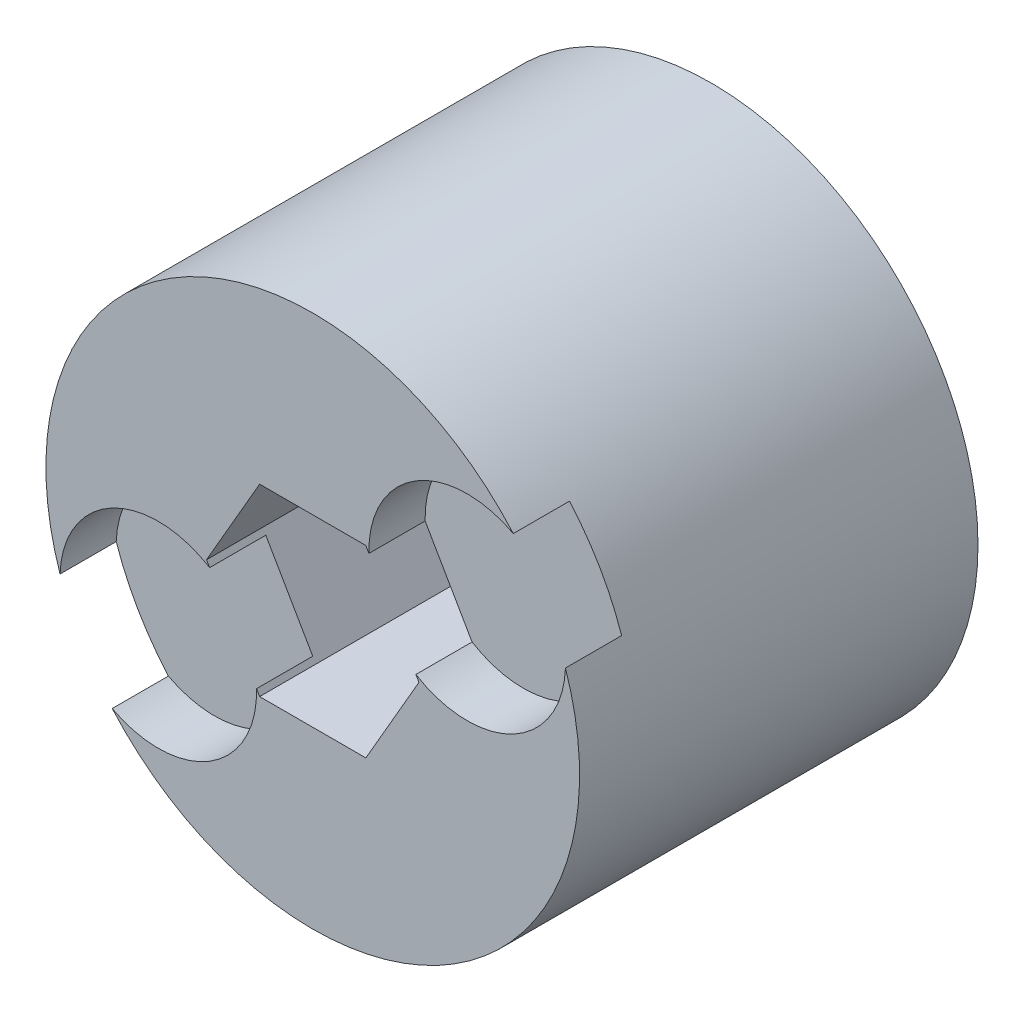
ISO-10303-21;
HEADER;
FILE_DESCRIPTION(('STEP AP214'),'2;1');
FILE_NAME('part.step','',(''),(''),'','','');
FILE_SCHEMA(('AUTOMOTIVE_DESIGN { 1 0 10303 214 1 1 1 1 }'));
ENDSEC;
DATA;
#1=APPLICATION_CONTEXT('core data for automotive mechanical design processes');
#2=APPLICATION_PROTOCOL_DEFINITION('international standard','automotive_design',2000,#1);
#3=PRODUCT_CONTEXT('',#1,'mechanical');
#4=PRODUCT('Part','Part','',(#3));
#5=PRODUCT_RELATED_PRODUCT_CATEGORY('part','',(#4));
#6=PRODUCT_DEFINITION_FORMATION('','',#4);
#7=PRODUCT_DEFINITION_CONTEXT('part definition',#1,'design');
#8=PRODUCT_DEFINITION('design','',#6,#7);
#9=PRODUCT_DEFINITION_SHAPE('','',#8);
#10=(LENGTH_UNIT() NAMED_UNIT(*) SI_UNIT(.MILLI.,.METRE.));
#11=(NAMED_UNIT(*) PLANE_ANGLE_UNIT() SI_UNIT($,.RADIAN.));
#12=(NAMED_UNIT(*) SI_UNIT($,.STERADIAN.) SOLID_ANGLE_UNIT());
#13=UNCERTAINTY_MEASURE_WITH_UNIT(LENGTH_MEASURE(1.E-05),#10,'distance_accuracy_value','');
#14=(GEOMETRIC_REPRESENTATION_CONTEXT(3) GLOBAL_UNCERTAINTY_ASSIGNED_CONTEXT((#13)) GLOBAL_UNIT_ASSIGNED_CONTEXT((#10,
#11,#12)) REPRESENTATION_CONTEXT('',''));
#15=CARTESIAN_POINT('',(0.,0.,0.));
#16=DIRECTION('',(0.,0.,1.));
#17=DIRECTION('',(1.,0.,0.));
#18=AXIS2_PLACEMENT_3D('',#15,#16,#17);
#19=CARTESIAN_POINT('',(0.,3.43496841987304E-13,14.185));
#20=DIRECTION('',(0.,0.,-1.));
#21=DIRECTION('',(0.500000000000004,-0.866025403784436,0.));
#22=AXIS2_PLACEMENT_3D('',#19,#20,#21);
#23=PLANE('',#22);
#24=CARTESIAN_POINT('',(0.,3.41369630215652E-13,14.185));
#25=DIRECTION('',(0.,0.,-1.));
#26=DIRECTION('',(0.,1.,0.));
#27=AXIS2_PLACEMENT_3D('',#24,#25,#26);
#28=CIRCLE('',#27,9.5);
#29=CARTESIAN_POINT('',(8.99703364415569,3.05014517784527,14.185));
#30=VERTEX_POINT('',#29);
#31=CARTESIAN_POINT('',(-7.14002003132211,-6.26658710561935,14.185));
#32=VERTEX_POINT('',#31);
#33=EDGE_CURVE('E196',#30,#32,#28,.T.);
#34=ORIENTED_EDGE('',*,*,#33,.F.);
#35=CARTESIAN_POINT('',(5.49926131403118,3.17500000000037,14.185));
#36=DIRECTION('',(0.,0.,-1.));
#37=DIRECTION('',(0.,1.,0.));
#38=AXIS2_PLACEMENT_3D('',#35,#36,#37);
#39=CIRCLE('',#38,3.50000000000001);
#40=CARTESIAN_POINT('',(3.67205240631425,0.189818664208528,14.185));
#41=VERTEX_POINT('',#40);
#42=EDGE_CURVE('E159',#30,#41,#39,.T.);
#43=ORIENTED_EDGE('',*,*,#42,.T.);
#44=DIRECTION('',(0.5,-0.866025403784439,0.));
#45=VECTOR('',#44,1.);
#46=CARTESIAN_POINT('',(1.89082213159591,3.27500000000057,14.185));
#47=LINE('',#46,#45);
#48=CARTESIAN_POINT('',(3.78164426319206,3.40873163029443E-13,14.185));
#49=VERTEX_POINT('',#48);
#50=EDGE_CURVE('E173',#41,#49,#47,.T.);
#51=ORIENTED_EDGE('',*,*,#50,.T.);
#52=DIRECTION('',(-0.5,-0.866025403784439,0.));
#53=VECTOR('',#52,1.);
#54=CARTESIAN_POINT('',(3.78164426319219,5.49315979621161E-13,14.185));
#55=LINE('',#54,#53);
#56=CARTESIAN_POINT('',(1.89082213159604,-3.27499999999966,14.1849999999999));
#57=VERTEX_POINT('',#56);
#58=EDGE_CURVE('E176',#49,#57,#55,.T.);
#59=ORIENTED_EDGE('',*,*,#58,.T.);
#60=DIRECTION('',(-1.,0.,0.));
#61=VECTOR('',#60,1.);
#62=CARTESIAN_POINT('',(1.89082213159602,-3.27499999999966,14.1849999999999));
#63=LINE('',#62,#61);
#64=CARTESIAN_POINT('',(-1.89082213159602,-3.27499999999966,14.1849999999999));
#65=VERTEX_POINT('',#64);
#66=EDGE_CURVE('E178',#57,#65,#63,.T.);
#67=ORIENTED_EDGE('',*,*,#66,.T.);
#68=DIRECTION('',(-0.500000000000001,0.866025403784438,0.));
#69=VECTOR('',#68,1.);
#70=CARTESIAN_POINT('',(-1.89082213159614,-3.27499999999944,14.1849999999999));
#71=LINE('',#70,#69);
#72=CARTESIAN_POINT('',(-2.00041398847381,-3.08518133579152,14.185));
#73=VERTEX_POINT('',#72);
#74=EDGE_CURVE('E166',#65,#73,#71,.T.);
#75=ORIENTED_EDGE('',*,*,#74,.T.);
#76=CARTESIAN_POINT('',(-5.49926131403116,-3.17499999999968,14.1849999999999));
#77=DIRECTION('',(0.,0.,-1.));
#78=DIRECTION('',(0.,1.,0.));
#79=AXIS2_PLACEMENT_3D('',#76,#77,#78);
#80=CIRCLE('',#79,3.5);
#81=EDGE_CURVE('E143',#73,#32,#80,.T.);
#82=ORIENTED_EDGE('',*,*,#81,.T.);
#83=EDGE_LOOP('',(#34,#43,#51,#59,#67,#75,#82));
#84=FACE_BOUND('',#83,.T.);
#85=ADVANCED_FACE('F34',(#84),#23,.F.);
#86=CARTESIAN_POINT('',(0.,3.41369630215652E-13,0.));
#87=DIRECTION('',(0.,0.,1.));
#88=DIRECTION('',(1.,0.,0.));
#89=AXIS2_PLACEMENT_3D('',#86,#87,#88);
#90=PLANE('',#89);
#91=CARTESIAN_POINT('',(0.,3.41369630215652E-13,0.));
#92=DIRECTION('',(0.,0.,1.));
#93=DIRECTION('',(1.,0.,0.));
#94=AXIS2_PLACEMENT_3D('',#91,#92,#93);
#95=CIRCLE('',#94,9.5);
#96=CARTESIAN_POINT('',(9.50000000000001,3.41369630215652E-13,0.));
#97=VERTEX_POINT('',#96);
#98=EDGE_CURVE('E191',#97,#97,#95,.T.);
#99=ORIENTED_EDGE('',*,*,#98,.F.);
#100=EDGE_LOOP('',(#99));
#101=FACE_BOUND('',#100,.T.);
#102=DIRECTION('',(0.5,0.866025403784439,0.));
#103=VECTOR('',#102,1.);
#104=CARTESIAN_POINT('',(3.78164426319206,3.40719108912161E-13,0.));
#105=LINE('',#104,#103);
#106=CARTESIAN_POINT('',(1.89082213159604,-3.27499999999966,0.));
#107=VERTEX_POINT('',#106);
#108=CARTESIAN_POINT('',(3.78164426319206,3.40719108912161E-13,0.));
#109=VERTEX_POINT('',#108);
#110=EDGE_CURVE('E198',#107,#109,#105,.T.);
#111=ORIENTED_EDGE('',*,*,#110,.T.);
#112=DIRECTION('',(-0.5,0.866025403784438,0.));
#113=VECTOR('',#112,1.);
#114=CARTESIAN_POINT('',(1.89082213159603,3.27500000000035,0.));
#115=LINE('',#114,#113);
#116=CARTESIAN_POINT('',(1.89082213159603,3.27500000000035,0.));
#117=VERTEX_POINT('',#116);
#118=EDGE_CURVE('E201',#109,#117,#115,.T.);
#119=ORIENTED_EDGE('',*,*,#118,.T.);
#120=DIRECTION('',(-1.,0.,0.));
#121=VECTOR('',#120,1.);
#122=CARTESIAN_POINT('',(-1.89082213159602,3.27500000000034,0.));
#123=LINE('',#122,#121);
#124=CARTESIAN_POINT('',(-1.89082213159602,3.27500000000034,0.));
#125=VERTEX_POINT('',#124);
#126=EDGE_CURVE('E205',#117,#125,#123,.T.);
#127=ORIENTED_EDGE('',*,*,#126,.T.);
#128=DIRECTION('',(-0.499999999999999,-0.866025403784439,0.));
#129=VECTOR('',#128,1.);
#130=CARTESIAN_POINT('',(-3.78164426319204,3.39634906739675E-13,0.));
#131=LINE('',#130,#129);
#132=CARTESIAN_POINT('',(-3.78164426319204,3.39634906739675E-13,0.));
#133=VERTEX_POINT('',#132);
#134=EDGE_CURVE('E208',#125,#133,#131,.T.);
#135=ORIENTED_EDGE('',*,*,#134,.T.);
#136=DIRECTION('',(0.500000000000001,-0.866025403784438,0.));
#137=VECTOR('',#136,1.);
#138=CARTESIAN_POINT('',(-1.89082213159602,-3.27499999999966,0.));
#139=LINE('',#138,#137);
#140=CARTESIAN_POINT('',(-1.89082213159602,-3.27499999999966,0.));
#141=VERTEX_POINT('',#140);
#142=EDGE_CURVE('E211',#133,#141,#139,.T.);
#143=ORIENTED_EDGE('',*,*,#142,.T.);
#144=DIRECTION('',(1.,0.,0.));
#145=VECTOR('',#144,1.);
#146=CARTESIAN_POINT('',(1.89082213159604,-3.27499999999966,0.));
#147=LINE('',#146,#145);
#148=EDGE_CURVE('E197',#141,#107,#147,.T.);
#149=ORIENTED_EDGE('',*,*,#148,.T.);
#150=EDGE_LOOP('',(#111,#119,#127,#135,#143,#149));
#151=FACE_BOUND('',#150,.T.);
#152=ADVANCED_FACE('F272',(#101,#151),#90,.F.);
#153=CARTESIAN_POINT('',(0.,3.41369630215652E-13,41.2550576850888));
#154=DIRECTION('',(0.,0.,-1.));
#155=DIRECTION('',(-1.,0.,0.));
#156=AXIS2_PLACEMENT_3D('',#153,#154,#155);
#157=CYLINDRICAL_SURFACE('',#156,9.5);
#158=CARTESIAN_POINT('',(0.,3.41369630215652E-13,12.185));
#159=DIRECTION('',(0.,0.,1.));
#160=DIRECTION('',(1.,0.,0.));
#161=AXIS2_PLACEMENT_3D('',#158,#159,#160);
#162=CIRCLE('',#161,9.5);
#163=CARTESIAN_POINT('',(8.99703364415569,3.05014517784527,12.185));
#164=VERTEX_POINT('',#163);
#165=CARTESIAN_POINT('',(7.1400200313221,6.26658710562005,12.185));
#166=VERTEX_POINT('',#165);
#167=EDGE_CURVE('E202',#164,#166,#162,.T.);
#168=ORIENTED_EDGE('',*,*,#167,.F.);
#169=DIRECTION('',(0.,0.,1.));
#170=VECTOR('',#169,1.);
#171=CARTESIAN_POINT('',(8.99703364415569,3.05014517784527,13.185));
#172=LINE('',#171,#170);
#173=EDGE_CURVE('E220',#164,#30,#172,.T.);
#174=ORIENTED_EDGE('',*,*,#173,.T.);
#175=ORIENTED_EDGE('',*,*,#33,.T.);
#176=DIRECTION('',(0.,0.,1.));
#177=VECTOR('',#176,1.);
#178=CARTESIAN_POINT('',(-7.14002003132211,-6.26658710561935,13.185));
#179=LINE('',#178,#177);
#180=CARTESIAN_POINT('',(-7.1400200313221,-6.26658710561935,12.185));
#181=VERTEX_POINT('',#180);
#182=EDGE_CURVE('E231',#32,#181,#179,.F.);
#183=ORIENTED_EDGE('',*,*,#182,.T.);
#184=CARTESIAN_POINT('',(0.,3.41369630215652E-13,12.185));
#185=DIRECTION('',(0.,0.,1.));
#186=DIRECTION('',(1.,0.,0.));
#187=AXIS2_PLACEMENT_3D('',#184,#185,#186);
#188=CIRCLE('',#187,9.5);
#189=CARTESIAN_POINT('',(-8.99703364415567,-3.0501451778446,12.185));
#190=VERTEX_POINT('',#189);
#191=EDGE_CURVE('E154',#190,#181,#188,.T.);
#192=ORIENTED_EDGE('',*,*,#191,.F.);
#193=DIRECTION('',(0.,0.,1.));
#194=VECTOR('',#193,1.);
#195=CARTESIAN_POINT('',(-8.99703364415567,-3.05014517784461,13.185));
#196=LINE('',#195,#194);
#197=CARTESIAN_POINT('',(-8.99703364415567,-3.05014517784461,14.185));
#198=VERTEX_POINT('',#197);
#199=EDGE_CURVE('E228',#190,#198,#196,.T.);
#200=ORIENTED_EDGE('',*,*,#199,.T.);
#201=CARTESIAN_POINT('',(7.1400200313221,6.26658710562005,14.185));
#202=VERTEX_POINT('',#201);
#203=EDGE_CURVE('E193',#198,#202,#28,.T.);
#204=ORIENTED_EDGE('',*,*,#203,.T.);
#205=DIRECTION('',(0.,0.,1.));
#206=VECTOR('',#205,1.);
#207=CARTESIAN_POINT('',(7.1400200313221,6.26658710562005,13.185));
#208=LINE('',#207,#206);
#209=EDGE_CURVE('E49',#202,#166,#208,.F.);
#210=ORIENTED_EDGE('',*,*,#209,.T.);
#211=EDGE_LOOP('',(#168,#174,#175,#183,#192,#200,#204,#210));
#212=FACE_BOUND('',#211,.T.);
#213=ORIENTED_EDGE('',*,*,#98,.T.);
#214=EDGE_LOOP('',(#213));
#215=FACE_BOUND('',#214,.T.);
#216=ADVANCED_FACE('F246',(#212,#215),#157,.T.);
#217=CARTESIAN_POINT('',(3.78164426319206,3.40719108912161E-13,41.2550576850888));
#218=DIRECTION('',(-0.866025403784439,0.5,0.));
#219=DIRECTION('',(-0.5,-0.866025403784439,0.));
#220=AXIS2_PLACEMENT_3D('',#217,#218,#219);
#221=PLANE('',#220);
#222=ORIENTED_EDGE('',*,*,#58,.F.);
#223=DIRECTION('',(0.,0.,-1.));
#224=VECTOR('',#223,1.);
#225=CARTESIAN_POINT('',(3.78164426319206,3.40719108912161E-13,41.2550576850888));
#226=LINE('',#225,#224);
#227=EDGE_CURVE('E189',#49,#109,#226,.T.);
#228=ORIENTED_EDGE('',*,*,#227,.T.);
#229=ORIENTED_EDGE('',*,*,#110,.F.);
#230=DIRECTION('',(0.,0.,-1.));
#231=VECTOR('',#230,1.);
#232=CARTESIAN_POINT('',(1.89082213159604,-3.27499999999966,41.2550576850888));
#233=LINE('',#232,#231);
#234=EDGE_CURVE('E179',#57,#107,#233,.T.);
#235=ORIENTED_EDGE('',*,*,#234,.F.);
#236=EDGE_LOOP('',(#222,#228,#229,#235));
#237=FACE_BOUND('',#236,.T.);
#238=ADVANCED_FACE('F285',(#237),#221,.T.);
#239=CARTESIAN_POINT('',(1.89082213159603,3.27500000000035,41.2550576850888));
#240=DIRECTION('',(-0.866025403784438,-0.5,0.));
#241=DIRECTION('',(0.5,-0.866025403784439,0.));
#242=AXIS2_PLACEMENT_3D('',#239,#240,#241);
#243=PLANE('',#242);
#244=DIRECTION('',(0.,0.,1.));
#245=VECTOR('',#244,1.);
#246=CARTESIAN_POINT('',(3.67205240631425,0.189818664208528,12.185));
#247=LINE('',#246,#245);
#248=CARTESIAN_POINT('',(3.67205240631425,0.189818664208528,12.185));
#249=VERTEX_POINT('',#248);
#250=EDGE_CURVE('E224',#249,#41,#247,.T.);
#251=ORIENTED_EDGE('',*,*,#250,.F.);
#252=DIRECTION('',(-0.5,0.866025403784439,0.));
#253=VECTOR('',#252,1.);
#254=CARTESIAN_POINT('',(1.89082213159603,3.27500000000035,12.185));
#255=LINE('',#254,#253);
#256=CARTESIAN_POINT('',(2.00041398847382,3.08518133579221,12.185));
#257=VERTEX_POINT('',#256);
#258=EDGE_CURVE('E12',#249,#257,#255,.T.);
#259=ORIENTED_EDGE('',*,*,#258,.T.);
#260=DIRECTION('',(0.,0.,1.));
#261=VECTOR('',#260,1.);
#262=CARTESIAN_POINT('',(2.00041398847382,3.08518133579221,12.185));
#263=LINE('',#262,#261);
#264=CARTESIAN_POINT('',(2.00041398847382,3.08518133579221,14.185));
#265=VERTEX_POINT('',#264);
#266=EDGE_CURVE('E226',#265,#257,#263,.F.);
#267=ORIENTED_EDGE('',*,*,#266,.F.);
#268=CARTESIAN_POINT('',(1.89082213159603,3.27500000000035,14.185));
#269=VERTEX_POINT('',#268);
#270=EDGE_CURVE('E165',#269,#265,#47,.T.);
#271=ORIENTED_EDGE('',*,*,#270,.F.);
#272=DIRECTION('',(0.,0.,-1.));
#273=VECTOR('',#272,1.);
#274=CARTESIAN_POINT('',(1.89082213159603,3.27500000000035,41.2550576850888));
#275=LINE('',#274,#273);
#276=EDGE_CURVE('E187',#269,#117,#275,.T.);
#277=ORIENTED_EDGE('',*,*,#276,.T.);
#278=ORIENTED_EDGE('',*,*,#118,.F.);
#279=ORIENTED_EDGE('',*,*,#227,.F.);
#280=ORIENTED_EDGE('',*,*,#50,.F.);
#281=EDGE_LOOP('',(#251,#259,#267,#271,#277,#278,#279,#280));
#282=FACE_BOUND('',#281,.T.);
#283=ADVANCED_FACE('F256',(#282),#243,.T.);
#284=CARTESIAN_POINT('',(-1.89082213159602,3.27500000000034,41.2550576850888));
#285=DIRECTION('',(0.,-1.,0.));
#286=DIRECTION('',(1.,0.,0.));
#287=AXIS2_PLACEMENT_3D('',#284,#285,#286);
#288=PLANE('',#287);
#289=DIRECTION('',(1.,0.,0.));
#290=VECTOR('',#289,1.);
#291=CARTESIAN_POINT('',(-1.89082213159604,3.27500000000034,14.185));
#292=LINE('',#291,#290);
#293=CARTESIAN_POINT('',(-1.89082213159602,3.27500000000034,14.185));
#294=VERTEX_POINT('',#293);
#295=EDGE_CURVE('E171',#294,#269,#292,.T.);
#296=ORIENTED_EDGE('',*,*,#295,.F.);
#297=DIRECTION('',(0.,0.,-1.));
#298=VECTOR('',#297,1.);
#299=CARTESIAN_POINT('',(-1.89082213159602,3.27500000000034,41.2550576850888));
#300=LINE('',#299,#298);
#301=EDGE_CURVE('E185',#294,#125,#300,.T.);
#302=ORIENTED_EDGE('',*,*,#301,.T.);
#303=ORIENTED_EDGE('',*,*,#126,.F.);
#304=ORIENTED_EDGE('',*,*,#276,.F.);
#305=EDGE_LOOP('',(#296,#302,#303,#304));
#306=FACE_BOUND('',#305,.T.);
#307=ADVANCED_FACE('F281',(#306),#288,.T.);
#308=CARTESIAN_POINT('',(-3.78164426319204,3.39634906739675E-13,41.2550576850888));
#309=DIRECTION('',(0.866025403784439,-0.499999999999999,0.));
#310=DIRECTION('',(0.5,0.866025403784439,0.));
#311=AXIS2_PLACEMENT_3D('',#308,#309,#310);
#312=PLANE('',#311);
#313=DIRECTION('',(0.5,0.866025403784439,0.));
#314=VECTOR('',#313,1.);
#315=CARTESIAN_POINT('',(-3.78164426319192,5.48231777448676E-13,14.185));
#316=LINE('',#315,#314);
#317=CARTESIAN_POINT('',(-3.78164426319204,3.3957212042246E-13,14.185));
#318=VERTEX_POINT('',#317);
#319=EDGE_CURVE('E168',#318,#294,#316,.T.);
#320=ORIENTED_EDGE('',*,*,#319,.F.);
#321=DIRECTION('',(0.,0.,-1.));
#322=VECTOR('',#321,1.);
#323=CARTESIAN_POINT('',(-3.78164426319204,3.39634906739675E-13,41.2550576850888));
#324=LINE('',#323,#322);
#325=EDGE_CURVE('E183',#318,#133,#324,.T.);
#326=ORIENTED_EDGE('',*,*,#325,.T.);
#327=ORIENTED_EDGE('',*,*,#134,.F.);
#328=ORIENTED_EDGE('',*,*,#301,.F.);
#329=EDGE_LOOP('',(#320,#326,#327,#328));
#330=FACE_BOUND('',#329,.T.);
#331=ADVANCED_FACE('F277',(#330),#312,.T.);
#332=CARTESIAN_POINT('',(-1.89082213159602,-3.27499999999966,41.2550576850888));
#333=DIRECTION('',(0.866025403784438,0.5,0.));
#334=DIRECTION('',(-0.500000000000001,0.866025403784438,0.));
#335=AXIS2_PLACEMENT_3D('',#332,#333,#334);
#336=PLANE('',#335);
#337=DIRECTION('',(0.,0.,1.));
#338=VECTOR('',#337,1.);
#339=CARTESIAN_POINT('',(-3.67205240631423,-0.189818664207852,12.185));
#340=LINE('',#339,#338);
#341=CARTESIAN_POINT('',(-3.67205240631423,-0.189818664207853,12.185));
#342=VERTEX_POINT('',#341);
#343=CARTESIAN_POINT('',(-3.67205240631423,-0.189818664207854,14.185));
#344=VERTEX_POINT('',#343);
#345=EDGE_CURVE('E57',#342,#344,#340,.T.);
#346=ORIENTED_EDGE('',*,*,#345,.F.);
#347=DIRECTION('',(0.500000000000001,-0.866025403784438,0.));
#348=VECTOR('',#347,1.);
#349=CARTESIAN_POINT('',(-1.89082213159602,-3.27499999999966,12.185));
#350=LINE('',#349,#348);
#351=CARTESIAN_POINT('',(-2.0004139884738,-3.08518133579152,12.185));
#352=VERTEX_POINT('',#351);
#353=EDGE_CURVE('E42',#342,#352,#350,.T.);
#354=ORIENTED_EDGE('',*,*,#353,.T.);
#355=DIRECTION('',(0.,0.,1.));
#356=VECTOR('',#355,1.);
#357=CARTESIAN_POINT('',(-2.00041398847381,-3.08518133579152,12.185));
#358=LINE('',#357,#356);
#359=EDGE_CURVE('E137',#73,#352,#358,.F.);
#360=ORIENTED_EDGE('',*,*,#359,.F.);
#361=ORIENTED_EDGE('',*,*,#74,.F.);
#362=DIRECTION('',(0.,0.,-1.));
#363=VECTOR('',#362,1.);
#364=CARTESIAN_POINT('',(-1.89082213159602,-3.27499999999966,41.2550576850888));
#365=LINE('',#364,#363);
#366=EDGE_CURVE('E181',#65,#141,#365,.T.);
#367=ORIENTED_EDGE('',*,*,#366,.T.);
#368=ORIENTED_EDGE('',*,*,#142,.F.);
#369=ORIENTED_EDGE('',*,*,#325,.F.);
#370=EDGE_CURVE('E169',#344,#318,#71,.T.);
#371=ORIENTED_EDGE('',*,*,#370,.F.);
#372=EDGE_LOOP('',(#346,#354,#360,#361,#367,#368,#369,#371));
#373=FACE_BOUND('',#372,.T.);
#374=ADVANCED_FACE('F157',(#373),#336,.T.);
#375=CARTESIAN_POINT('',(1.89082213159604,-3.27499999999966,41.2550576850888));
#376=DIRECTION('',(0.,1.,0.));
#377=DIRECTION('',(-1.,0.,0.));
#378=AXIS2_PLACEMENT_3D('',#375,#376,#377);
#379=PLANE('',#378);
#380=ORIENTED_EDGE('',*,*,#66,.F.);
#381=ORIENTED_EDGE('',*,*,#234,.T.);
#382=ORIENTED_EDGE('',*,*,#148,.F.);
#383=ORIENTED_EDGE('',*,*,#366,.F.);
#384=EDGE_LOOP('',(#380,#381,#382,#383));
#385=FACE_BOUND('',#384,.T.);
#386=ADVANCED_FACE('F268',(#385),#379,.T.);
#387=ORIENTED_EDGE('',*,*,#270,.T.);
#388=CARTESIAN_POINT('',(5.49926131403118,3.17500000000037,14.185));
#389=DIRECTION('',(0.,0.,1.));
#390=DIRECTION('',(1.,0.,0.));
#391=AXIS2_PLACEMENT_3D('',#388,#389,#390);
#392=CIRCLE('',#391,3.50000000000001);
#393=EDGE_CURVE('E234',#202,#265,#392,.T.);
#394=ORIENTED_EDGE('',*,*,#393,.F.);
#395=ORIENTED_EDGE('',*,*,#203,.F.);
#396=EDGE_CURVE('E163',#198,#344,#80,.T.);
#397=ORIENTED_EDGE('',*,*,#396,.T.);
#398=ORIENTED_EDGE('',*,*,#370,.T.);
#399=ORIENTED_EDGE('',*,*,#319,.T.);
#400=ORIENTED_EDGE('',*,*,#295,.T.);
#401=EDGE_LOOP('',(#387,#394,#395,#397,#398,#399,#400));
#402=FACE_BOUND('',#401,.T.);
#403=ADVANCED_FACE('F36',(#402),#23,.F.);
#404=CARTESIAN_POINT('',(-5.49926131403116,-3.17499999999968,12.185));
#405=DIRECTION('',(0.,0.,1.));
#406=DIRECTION('',(1.,0.,0.));
#407=AXIS2_PLACEMENT_3D('',#404,#405,#406);
#408=PLANE('',#407);
#409=ORIENTED_EDGE('',*,*,#191,.T.);
#410=CARTESIAN_POINT('',(-5.49926131403116,-3.17499999999968,12.185));
#411=DIRECTION('',(0.,0.,1.));
#412=DIRECTION('',(1.,0.,0.));
#413=AXIS2_PLACEMENT_3D('',#410,#411,#412);
#414=CIRCLE('',#413,3.5);
#415=EDGE_CURVE('E140',#181,#352,#414,.T.);
#416=ORIENTED_EDGE('',*,*,#415,.T.);
#417=ORIENTED_EDGE('',*,*,#353,.F.);
#418=EDGE_CURVE('E155',#342,#190,#414,.T.);
#419=ORIENTED_EDGE('',*,*,#418,.T.);
#420=EDGE_LOOP('',(#409,#416,#417,#419));
#421=FACE_BOUND('',#420,.T.);
#422=ADVANCED_FACE('F151',(#421),#408,.T.);
#423=CARTESIAN_POINT('',(-5.49926131403116,-3.17499999999968,12.185));
#424=DIRECTION('',(0.,0.,1.));
#425=DIRECTION('',(1.,0.,0.));
#426=AXIS2_PLACEMENT_3D('',#423,#424,#425);
#427=CYLINDRICAL_SURFACE('',#426,3.5);
#428=ORIENTED_EDGE('',*,*,#418,.F.);
#429=ORIENTED_EDGE('',*,*,#345,.T.);
#430=ORIENTED_EDGE('',*,*,#396,.F.);
#431=ORIENTED_EDGE('',*,*,#199,.F.);
#432=EDGE_LOOP('',(#428,#429,#430,#431));
#433=FACE_BOUND('',#432,.T.);
#434=ADVANCED_FACE('F304',(#433),#427,.F.);
#435=ORIENTED_EDGE('',*,*,#81,.F.);
#436=ORIENTED_EDGE('',*,*,#359,.T.);
#437=ORIENTED_EDGE('',*,*,#415,.F.);
#438=ORIENTED_EDGE('',*,*,#182,.F.);
#439=EDGE_LOOP('',(#435,#436,#437,#438));
#440=FACE_BOUND('',#439,.T.);
#441=ADVANCED_FACE('F139',(#440),#427,.F.);
#442=CARTESIAN_POINT('',(5.49926131403118,3.17500000000037,12.185));
#443=DIRECTION('',(0.,0.,1.));
#444=DIRECTION('',(1.,0.,0.));
#445=AXIS2_PLACEMENT_3D('',#442,#443,#444);
#446=PLANE('',#445);
#447=ORIENTED_EDGE('',*,*,#167,.T.);
#448=CARTESIAN_POINT('',(5.49926131403118,3.17500000000037,12.185));
#449=DIRECTION('',(0.,0.,1.));
#450=DIRECTION('',(1.,0.,0.));
#451=AXIS2_PLACEMENT_3D('',#448,#449,#450);
#452=CIRCLE('',#451,3.50000000000001);
#453=EDGE_CURVE('E148',#166,#257,#452,.T.);
#454=ORIENTED_EDGE('',*,*,#453,.T.);
#455=ORIENTED_EDGE('',*,*,#258,.F.);
#456=EDGE_CURVE('E236',#249,#164,#452,.T.);
#457=ORIENTED_EDGE('',*,*,#456,.T.);
#458=EDGE_LOOP('',(#447,#454,#455,#457));
#459=FACE_BOUND('',#458,.T.);
#460=ADVANCED_FACE('F242',(#459),#446,.T.);
#461=CARTESIAN_POINT('',(5.49926131403118,3.17500000000037,12.185));
#462=DIRECTION('',(0.,0.,1.));
#463=DIRECTION('',(1.,0.,0.));
#464=AXIS2_PLACEMENT_3D('',#461,#462,#463);
#465=CYLINDRICAL_SURFACE('',#464,3.50000000000001);
#466=ORIENTED_EDGE('',*,*,#456,.F.);
#467=ORIENTED_EDGE('',*,*,#250,.T.);
#468=ORIENTED_EDGE('',*,*,#42,.F.);
#469=ORIENTED_EDGE('',*,*,#173,.F.);
#470=EDGE_LOOP('',(#466,#467,#468,#469));
#471=FACE_BOUND('',#470,.T.);
#472=ADVANCED_FACE('F260',(#471),#465,.F.);
#473=ORIENTED_EDGE('',*,*,#393,.T.);
#474=ORIENTED_EDGE('',*,*,#266,.T.);
#475=ORIENTED_EDGE('',*,*,#453,.F.);
#476=ORIENTED_EDGE('',*,*,#209,.F.);
#477=EDGE_LOOP('',(#473,#474,#475,#476));
#478=FACE_BOUND('',#477,.T.);
#479=ADVANCED_FACE('F254',(#478),#465,.F.);
#480=CLOSED_SHELL('',(#85,#152,#216,#238,#283,#307,#331,#374,#386,#403,#422,#434,#441,#460,#472,#479));
#481=MANIFOLD_SOLID_BREP('B2',#480);
#482=ADVANCED_BREP_SHAPE_REPRESENTATION('',(#18,#481),#14);
#483=SHAPE_DEFINITION_REPRESENTATION(#9,#482);
ENDSEC;
END-ISO-10303-21;
